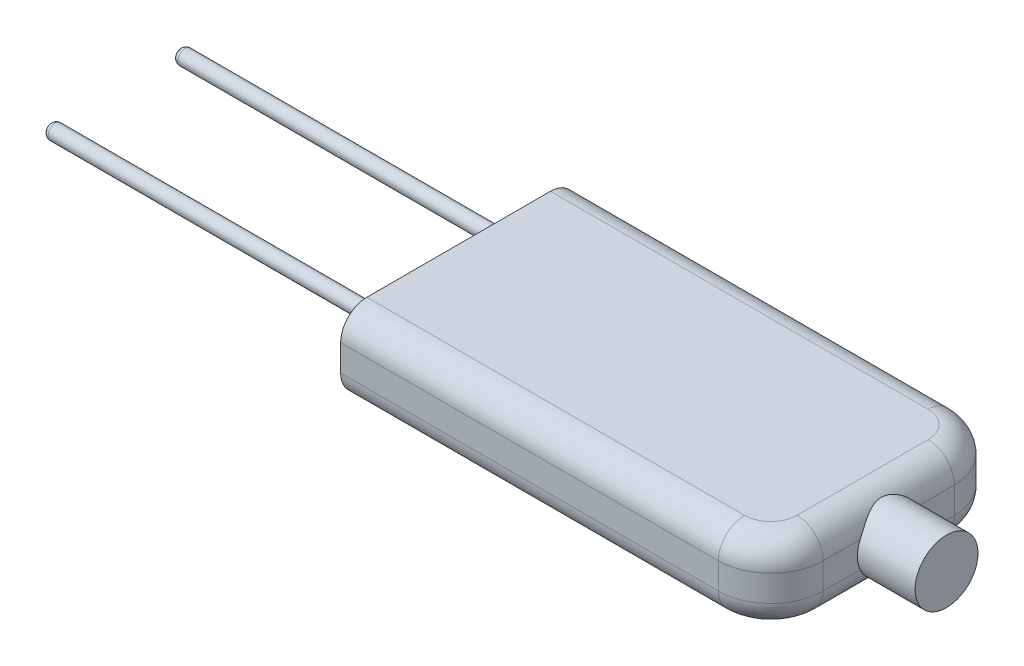
ISO-10303-21;
HEADER;
FILE_DESCRIPTION(('STEP AP214'),'2;1');
FILE_NAME('part.step','',(''),(''),'','','');
FILE_SCHEMA(('AUTOMOTIVE_DESIGN { 1 0 10303 214 1 1 1 1 }'));
ENDSEC;
DATA;
#1=APPLICATION_CONTEXT('core data for automotive mechanical design processes');
#2=APPLICATION_PROTOCOL_DEFINITION('international standard','automotive_design',2000,#1);
#3=PRODUCT_CONTEXT('',#1,'mechanical');
#4=PRODUCT('Part','Part','',(#3));
#5=PRODUCT_RELATED_PRODUCT_CATEGORY('part','',(#4));
#6=PRODUCT_DEFINITION_FORMATION('','',#4);
#7=PRODUCT_DEFINITION_CONTEXT('part definition',#1,'design');
#8=PRODUCT_DEFINITION('design','',#6,#7);
#9=PRODUCT_DEFINITION_SHAPE('','',#8);
#10=(LENGTH_UNIT() NAMED_UNIT(*) SI_UNIT(.MILLI.,.METRE.));
#11=(NAMED_UNIT(*) PLANE_ANGLE_UNIT() SI_UNIT($,.RADIAN.));
#12=(NAMED_UNIT(*) SI_UNIT($,.STERADIAN.) SOLID_ANGLE_UNIT());
#13=UNCERTAINTY_MEASURE_WITH_UNIT(LENGTH_MEASURE(1.E-05),#10,'distance_accuracy_value','');
#14=(GEOMETRIC_REPRESENTATION_CONTEXT(3) GLOBAL_UNCERTAINTY_ASSIGNED_CONTEXT((#13)) GLOBAL_UNIT_ASSIGNED_CONTEXT((#10,
#11,#12)) REPRESENTATION_CONTEXT('',''));
#15=CARTESIAN_POINT('',(0.,0.,0.));
#16=DIRECTION('',(0.,0.,1.));
#17=DIRECTION('',(1.,0.,0.));
#18=AXIS2_PLACEMENT_3D('',#15,#16,#17);
#19=CARTESIAN_POINT('',(82.,15.,-10.));
#20=DIRECTION('',(-1.,0.,0.));
#21=DIRECTION('',(0.,0.,1.));
#22=AXIS2_PLACEMENT_3D('',#19,#20,#21);
#23=PLANE('',#22);
#24=CARTESIAN_POINT('',(82.,7.5,-22.5));
#25=DIRECTION('',(-1.,0.,0.));
#26=DIRECTION('',(0.,0.,1.));
#27=AXIS2_PLACEMENT_3D('',#24,#25,#26);
#28=CIRCLE('',#27,6.);
#29=CARTESIAN_POINT('',(82.,5.,-27.9543560573178));
#30=VERTEX_POINT('',#29);
#31=CARTESIAN_POINT('',(82.,10.,-27.9543560573178));
#32=VERTEX_POINT('',#31);
#33=EDGE_CURVE('E57',#30,#32,#28,.F.);
#34=ORIENTED_EDGE('',*,*,#33,.F.);
#35=DIRECTION('',(0.,0.,-1.));
#36=VECTOR('',#35,1.);
#37=CARTESIAN_POINT('',(82.,5.,-35.));
#38=LINE('',#37,#36);
#39=CARTESIAN_POINT('',(82.,5.,-35.));
#40=VERTEX_POINT('',#39);
#41=EDGE_CURVE('E177',#30,#40,#38,.T.);
#42=ORIENTED_EDGE('',*,*,#41,.T.);
#43=DIRECTION('',(0.,-1.,0.));
#44=VECTOR('',#43,1.);
#45=CARTESIAN_POINT('',(82.,15.,-35.));
#46=LINE('',#45,#44);
#47=CARTESIAN_POINT('',(82.,10.,-35.));
#48=VERTEX_POINT('',#47);
#49=EDGE_CURVE('E364',#48,#40,#46,.T.);
#50=ORIENTED_EDGE('',*,*,#49,.F.);
#51=DIRECTION('',(0.,0.,-1.));
#52=VECTOR('',#51,1.);
#53=CARTESIAN_POINT('',(82.,10.,-10.));
#54=LINE('',#53,#52);
#55=EDGE_CURVE('E172',#48,#32,#54,.F.);
#56=ORIENTED_EDGE('',*,*,#55,.T.);
#57=EDGE_LOOP('',(#34,#42,#50,#56));
#58=FACE_BOUND('',#57,.T.);
#59=ADVANCED_FACE('F41',(#58),#23,.F.);
#60=CARTESIAN_POINT('',(77.,5.,-10.));
#61=DIRECTION('',(0.,0.,1.));
#62=DIRECTION('',(1.,0.,0.));
#63=AXIS2_PLACEMENT_3D('',#60,#61,#62);
#64=CYLINDRICAL_SURFACE('',#63,5.);
#65=ORIENTED_EDGE('',*,*,#41,.F.);
#66=CARTESIAN_POINT('',(82.,5.,-27.9543560573178));
#67=CARTESIAN_POINT('',(82.0000206078122,4.86811430190182,-27.8939434848491));
#68=CARTESIAN_POINT('',(81.9947843106151,4.73853451016481,-27.8287284437508));
#69=CARTESIAN_POINT('',(81.9750366002314,4.48514645133783,-27.6895479723205));
#70=CARTESIAN_POINT('',(81.9605396686491,4.36132949619952,-27.6155963509948));
#71=CARTESIAN_POINT('',(81.9236828228434,4.12138783610076,-27.4603665223907));
#72=CARTESIAN_POINT('',(81.9014011541239,4.00519977040379,-27.3791669982449));
#73=CARTESIAN_POINT('',(81.8501897811419,3.77974396942501,-27.2095223367052));
#74=CARTESIAN_POINT('',(81.8212575476597,3.67047888718214,-27.1210744510044));
#75=CARTESIAN_POINT('',(81.7581761789057,3.45994798360489,-26.938165001419));
#76=CARTESIAN_POINT('',(81.7240600834218,3.35863726492462,-26.8437435905785));
#77=CARTESIAN_POINT('',(81.6516920683105,3.16353703678495,-26.6489869142817));
#78=CARTESIAN_POINT('',(81.6134405828231,3.06974673961645,-26.5486522701084));
#79=CARTESIAN_POINT('',(81.4939074939547,2.79915696911305,-26.238649125854));
#80=CARTESIAN_POINT('',(81.4080598144038,2.63380163464768,-26.0205612433246));
#81=CARTESIAN_POINT('',(81.2685669195685,2.39419271926012,-25.6555782156911));
#82=CARTESIAN_POINT('',(81.2156851210521,2.30985272546184,-25.51484157985));
#83=CARTESIAN_POINT('',(81.1112320463222,2.15277872125521,-25.2265749694038));
#84=CARTESIAN_POINT('',(81.0596610820182,2.08004745177334,-25.0790434010167));
#85=CARTESIAN_POINT('',(80.9106523400192,1.88001033253256,-24.6269572453567));
#86=CARTESIAN_POINT('',(80.8186028075533,1.77035959207362,-24.312150549864));
#87=CARTESIAN_POINT('',(80.7177058825755,1.65629342619354,-23.866242897921));
#88=CARTESIAN_POINT('',(80.6929521926347,1.62907662821801,-23.7442018882714));
#89=CARTESIAN_POINT('',(80.6496032333209,1.5821915442243,-23.497628152133));
#90=CARTESIAN_POINT('',(80.6310041216067,1.56251854734135,-23.3730970319332));
#91=CARTESIAN_POINT('',(80.6009393157597,1.53103561541514,-23.1224121009216));
#92=CARTESIAN_POINT('',(80.5894610821,1.51921185565067,-22.9962615441395));
#93=CARTESIAN_POINT('',(80.5742370360371,1.50358030106402,-22.7429896167497));
#94=CARTESIAN_POINT('',(80.570491166131,1.49977244663026,-22.6158682533687));
#95=CARTESIAN_POINT('',(80.5709583576714,1.50024907489802,-22.3614033598221));
#96=CARTESIAN_POINT('',(80.5751872119432,1.50454961513737,-22.2340598888199));
#97=CARTESIAN_POINT('',(80.5913794966899,1.52118901703152,-21.9804054556393));
#98=CARTESIAN_POINT('',(80.6033430209725,1.53352797617783,-21.8540945060025));
#99=CARTESIAN_POINT('',(80.6343522626202,1.56605414035887,-21.6031630546645));
#100=CARTESIAN_POINT('',(80.6534094638615,1.58625407386382,-21.4785456355406));
#101=CARTESIAN_POINT('',(80.6976287171138,1.63420039034599,-21.2318458822736));
#102=CARTESIAN_POINT('',(80.7227945491546,1.66195144726089,-21.1097651688247));
#103=CARTESIAN_POINT('',(80.8238066651791,1.77653006243144,-20.6694412871725));
#104=CARTESIAN_POINT('',(80.9147444729556,1.88526427853597,-20.360004926468));
#105=CARTESIAN_POINT('',(81.0616543874105,2.08284902757324,-19.9152347829638));
#106=CARTESIAN_POINT('',(81.1124732570568,2.15461410302223,-19.7699712464438));
#107=CARTESIAN_POINT('',(81.2153935627314,2.3094456660752,-19.4859915441789));
#108=CARTESIAN_POINT('',(81.2674948560092,2.39251090044198,-19.3472746546768));
#109=CARTESIAN_POINT('',(81.3722489209929,2.57213054639544,-19.0730901532841));
#110=CARTESIAN_POINT('',(81.4248778922203,2.66899140344898,-18.9378147502189));
#111=CARTESIAN_POINT('',(81.5270741238093,2.87426594034905,-18.675033002042));
#112=CARTESIAN_POINT('',(81.5766409770184,2.98268115131223,-18.5475276901058));
#113=CARTESIAN_POINT('',(81.6703546241491,3.21034201274667,-18.3015729989937));
#114=CARTESIAN_POINT('',(81.7145250825754,3.32953607034424,-18.1830850082999));
#115=CARTESIAN_POINT('',(81.795561331734,3.57882093471574,-17.9554640004896));
#116=CARTESIAN_POINT('',(81.8324304907088,3.70890667733494,-17.8463266829572));
#117=CARTESIAN_POINT('',(81.8854973057507,3.93223406331174,-17.6747119597241));
#118=CARTESIAN_POINT('',(81.904422441446,4.02253064246881,-17.6092209154592));
#119=CARTESIAN_POINT('',(81.9376374241019,4.20719886811106,-17.4830327462725));
#120=CARTESIAN_POINT('',(81.9519290991216,4.30156889079065,-17.422333737896));
#121=CARTESIAN_POINT('',(81.9753541835157,4.49466747141161,-17.3056987261606));
#122=CARTESIAN_POINT('',(81.9844543362036,4.59341985666286,-17.2497953381409));
#123=CARTESIAN_POINT('',(81.9967845834705,4.79431411434572,-17.1434865020971));
#124=CARTESIAN_POINT('',(82.0000089357705,4.89645920325483,-17.093086477537));
#125=CARTESIAN_POINT('',(82.,5.,-17.0456439426821));
#126=B_SPLINE_CURVE_WITH_KNOTS('',3,(#66,#67,#68,#69,#70,#71,#72,#73,#74,#75,#76,#77,#78,#79,
#80,#81,#82,#83,#84,#85,#86,#87,#88,#89,#90,#91,#92,#93,#94,#95,#96,#97,#98,#99,#100,#101,#102,
#103,#104,#105,#106,#107,#108,#109,#110,#111,#112,#113,#114,#115,#116,#117,#118,#119,#120,#121,
#122,#123,#124,#125),.UNSPECIFIED.,.F.,.F.,(4,2,2,2,2,2,2,2,2,2,2,2,2,2,2,2,2,2,2,2,2,2,2,2,2,2,
2,2,2,4),(0.,0.434860604064224,0.869042840552932,1.29898096392539,1.72908286471325,
2.15655032545085,2.58397295345303,3.44151297424773,3.95819448323737,4.47499780559064,
5.50573967978283,5.88785171746291,6.26972474817521,6.65092339555977,7.03211920808833,
7.41407071843789,7.79602686125654,8.17860405718535,8.5614185986817,9.57608100281526,
10.0852004747092,10.5942635289813,11.1172296120256,11.6402650819037,12.1609176463485,
12.6813294604525,13.0205129430387,13.359562442794,13.7007601714588,14.0422911660372),.UNSPECIFIED.);
#127=CARTESIAN_POINT('',(82.,5.,-17.0456439426821));
#128=VERTEX_POINT('',#127);
#129=EDGE_CURVE('E232',#30,#128,#126,.T.);
#130=ORIENTED_EDGE('',*,*,#129,.T.);
#131=CARTESIAN_POINT('',(82.,5.,-10.));
#132=VERTEX_POINT('',#131);
#133=EDGE_CURVE('E162',#132,#128,#38,.T.);
#134=ORIENTED_EDGE('',*,*,#133,.F.);
#135=CARTESIAN_POINT('',(77.,5.,-10.));
#136=DIRECTION('',(0.,0.,-1.));
#137=DIRECTION('',(-1.,0.,0.));
#138=AXIS2_PLACEMENT_3D('',#135,#136,#137);
#139=CIRCLE('',#138,5.);
#140=CARTESIAN_POINT('',(77.,0.,-10.));
#141=VERTEX_POINT('',#140);
#142=EDGE_CURVE('E218',#132,#141,#139,.T.);
#143=ORIENTED_EDGE('',*,*,#142,.T.);
#144=DIRECTION('',(0.,0.,-1.));
#145=VECTOR('',#144,1.);
#146=CARTESIAN_POINT('',(77.,0.,-10.));
#147=LINE('',#146,#145);
#148=CARTESIAN_POINT('',(77.,0.,-35.));
#149=VERTEX_POINT('',#148);
#150=EDGE_CURVE('E351',#149,#141,#147,.F.);
#151=ORIENTED_EDGE('',*,*,#150,.F.);
#152=CARTESIAN_POINT('',(77.,5.,-35.));
#153=DIRECTION('',(0.,0.,-1.));
#154=DIRECTION('',(-1.,0.,0.));
#155=AXIS2_PLACEMENT_3D('',#152,#153,#154);
#156=CIRCLE('',#155,5.);
#157=EDGE_CURVE('E213',#40,#149,#156,.T.);
#158=ORIENTED_EDGE('',*,*,#157,.F.);
#159=EDGE_LOOP('',(#65,#130,#134,#143,#151,#158));
#160=FACE_BOUND('',#159,.T.);
#161=ADVANCED_FACE('F272',(#160),#64,.T.);
#162=CARTESIAN_POINT('',(77.,10.,-35.));
#163=DIRECTION('',(0.,0.,-1.));
#164=DIRECTION('',(-1.,0.,0.));
#165=AXIS2_PLACEMENT_3D('',#162,#163,#164);
#166=CYLINDRICAL_SURFACE('',#165,5.);
#167=CARTESIAN_POINT('',(82.,10.,-17.0456439426821));
#168=VERTEX_POINT('',#167);
#169=CARTESIAN_POINT('',(82.,10.,-10.));
#170=VERTEX_POINT('',#169);
#171=EDGE_CURVE('E159',#168,#170,#54,.F.);
#172=ORIENTED_EDGE('',*,*,#171,.F.);
#173=CARTESIAN_POINT('',(82.,10.,-17.0456439426821));
#174=CARTESIAN_POINT('',(82.0000206078122,10.1318856980982,-17.1060565151508));
#175=CARTESIAN_POINT('',(81.9947843106151,10.2614654898352,-17.1712715562491));
#176=CARTESIAN_POINT('',(81.9750366002314,10.5148535486622,-17.3104520276794));
#177=CARTESIAN_POINT('',(81.9605396686491,10.6386705038005,-17.3844036490051));
#178=CARTESIAN_POINT('',(81.9236828228434,10.8786121638992,-17.5396334776092));
#179=CARTESIAN_POINT('',(81.9014011541239,10.9948002295962,-17.620833001755));
#180=CARTESIAN_POINT('',(81.8501897811419,11.220256030575,-17.7904776632947));
#181=CARTESIAN_POINT('',(81.8212575476597,11.3295211128179,-17.8789255489955));
#182=CARTESIAN_POINT('',(81.7581761789057,11.5400520163951,-18.0618349985809));
#183=CARTESIAN_POINT('',(81.7240600834218,11.6413627350754,-18.1562564094214));
#184=CARTESIAN_POINT('',(81.6516920683105,11.836462963215,-18.3510130857182));
#185=CARTESIAN_POINT('',(81.6134405828231,11.9302532603836,-18.4513477298916));
#186=CARTESIAN_POINT('',(81.4939074939548,12.200843030887,-18.7613508741459));
#187=CARTESIAN_POINT('',(81.4080598144038,12.3661983653523,-18.9794387566754));
#188=CARTESIAN_POINT('',(81.2685669195685,12.6058072807399,-19.3444217843089));
#189=CARTESIAN_POINT('',(81.2156851210521,12.6901472745382,-19.48515842015));
#190=CARTESIAN_POINT('',(81.1112320463222,12.8472212787448,-19.7734250305962));
#191=CARTESIAN_POINT('',(81.0596610820182,12.9199525482267,-19.9209565989832));
#192=CARTESIAN_POINT('',(80.9106523400192,13.1199896674674,-20.3730427546432));
#193=CARTESIAN_POINT('',(80.8186028075533,13.2296404079264,-20.6878494501359));
#194=CARTESIAN_POINT('',(80.7177058825755,13.3437065738065,-21.1337571020789));
#195=CARTESIAN_POINT('',(80.6929521926347,13.370923371782,-21.2557981117285));
#196=CARTESIAN_POINT('',(80.6496032333209,13.4178084557757,-21.5023718478669));
#197=CARTESIAN_POINT('',(80.6310041216067,13.4374814526587,-21.6269029680667));
#198=CARTESIAN_POINT('',(80.6009393157597,13.4689643845849,-21.8775878990784));
#199=CARTESIAN_POINT('',(80.5894610821,13.4807881443493,-22.0037384558605));
#200=CARTESIAN_POINT('',(80.5742370360371,13.496419698936,-22.2570103832502));
#201=CARTESIAN_POINT('',(80.570491166131,13.5002275533697,-22.3841317466312));
#202=CARTESIAN_POINT('',(80.5709583576714,13.499750925102,-22.6385966401778));
#203=CARTESIAN_POINT('',(80.5751872119432,13.4954503848626,-22.7659401111801));
#204=CARTESIAN_POINT('',(80.5913794966899,13.4788109829685,-23.0195945443606));
#205=CARTESIAN_POINT('',(80.6033430209725,13.4664720238222,-23.1459054939974));
#206=CARTESIAN_POINT('',(80.6343522626202,13.4339458596411,-23.3968369453354));
#207=CARTESIAN_POINT('',(80.6534094638615,13.4137459261362,-23.5214543644594));
#208=CARTESIAN_POINT('',(80.6976287171138,13.365799609654,-23.7681541177263));
#209=CARTESIAN_POINT('',(80.7227945491546,13.3380485527391,-23.8902348311752));
#210=CARTESIAN_POINT('',(80.8238066651791,13.2234699375686,-24.3305587128274));
#211=CARTESIAN_POINT('',(80.9147444729556,13.114735721464,-24.6399950735319));
#212=CARTESIAN_POINT('',(81.0616543874105,12.9171509724268,-25.0847652170362));
#213=CARTESIAN_POINT('',(81.1124732570568,12.8453858969778,-25.2300287535561));
#214=CARTESIAN_POINT('',(81.2153935627314,12.6905543339248,-25.514008455821));
#215=CARTESIAN_POINT('',(81.2674948560092,12.607489099558,-25.6527253453232));
#216=CARTESIAN_POINT('',(81.3722489209929,12.4278694536046,-25.9269098467158));
#217=CARTESIAN_POINT('',(81.4248778922203,12.331008596551,-26.062185249781));
#218=CARTESIAN_POINT('',(81.5270741238093,12.1257340596509,-26.3249669979579));
#219=CARTESIAN_POINT('',(81.5766409770184,12.0173188486878,-26.4524723098942));
#220=CARTESIAN_POINT('',(81.6703546241491,11.7896579872533,-26.6984270010063));
#221=CARTESIAN_POINT('',(81.7145250825754,11.6704639296558,-26.8169149917));
#222=CARTESIAN_POINT('',(81.795561331734,11.4211790652843,-27.0445359995103));
#223=CARTESIAN_POINT('',(81.8324304907088,11.2910933226651,-27.1536733170428));
#224=CARTESIAN_POINT('',(81.8854973057507,11.0677659366883,-27.3252880402758));
#225=CARTESIAN_POINT('',(81.904422441446,10.9774693575312,-27.3907790845408));
#226=CARTESIAN_POINT('',(81.9376374241019,10.7928011318889,-27.5169672537274));
#227=CARTESIAN_POINT('',(81.9519290991216,10.6984311092094,-27.5776662621039));
#228=CARTESIAN_POINT('',(81.9753541835157,10.5053325285884,-27.6943012738393));
#229=CARTESIAN_POINT('',(81.9844543362036,10.4065801433371,-27.7502046618591));
#230=CARTESIAN_POINT('',(81.9967845834705,10.2056858856543,-27.8565134979028));
#231=CARTESIAN_POINT('',(82.0000089357705,10.1035407967452,-27.9069135224629));
#232=CARTESIAN_POINT('',(82.,9.99999999999999,-27.9543560573178));
#233=B_SPLINE_CURVE_WITH_KNOTS('',3,(#173,#174,#175,#176,#177,#178,#179,#180,#181,#182,#183,
#184,#185,#186,#187,#188,#189,#190,#191,#192,#193,#194,#195,#196,#197,#198,#199,#200,#201,#202,
#203,#204,#205,#206,#207,#208,#209,#210,#211,#212,#213,#214,#215,#216,#217,#218,#219,#220,#221,
#222,#223,#224,#225,#226,#227,#228,#229,#230,#231,#232),.UNSPECIFIED.,.F.,.F.,(4,2,2,2,2,2,2,2,
2,2,2,2,2,2,2,2,2,2,2,2,2,2,2,2,2,2,2,2,2,4),(0.,0.434860604064224,0.869042840552934,
1.2989809639254,1.72908286471325,2.15655032545085,2.58397295345304,3.44151297424773,
3.95819448323737,4.47499780559064,5.50573967978283,5.88785171746291,6.26972474817521,
6.65092339555977,7.03211920808833,7.41407071843789,7.79602686125654,8.17860405718535,
8.5614185986817,9.57608100281526,10.0852004747092,10.5942635289813,11.1172296120257,
11.6402650819037,12.1609176463485,12.6813294604525,13.0205129430387,13.359562442794,
13.7007601714588,14.0422911660372),.UNSPECIFIED.);
#234=EDGE_CURVE('E141',#168,#32,#233,.T.);
#235=ORIENTED_EDGE('',*,*,#234,.T.);
#236=ORIENTED_EDGE('',*,*,#55,.F.);
#237=CARTESIAN_POINT('',(77.,10.,-35.));
#238=DIRECTION('',(0.,0.,-1.));
#239=DIRECTION('',(-1.,0.,0.));
#240=AXIS2_PLACEMENT_3D('',#237,#238,#239);
#241=CIRCLE('',#240,5.);
#242=CARTESIAN_POINT('',(77.,15.,-35.));
#243=VERTEX_POINT('',#242);
#244=EDGE_CURVE('E231',#243,#48,#241,.T.);
#245=ORIENTED_EDGE('',*,*,#244,.F.);
#246=DIRECTION('',(0.,0.,-1.));
#247=VECTOR('',#246,1.);
#248=CARTESIAN_POINT('',(77.,15.,-35.));
#249=LINE('',#248,#247);
#250=CARTESIAN_POINT('',(77.,15.,-10.));
#251=VERTEX_POINT('',#250);
#252=EDGE_CURVE('E196',#251,#243,#249,.T.);
#253=ORIENTED_EDGE('',*,*,#252,.F.);
#254=CARTESIAN_POINT('',(77.,10.,-10.));
#255=DIRECTION('',(0.,0.,-1.));
#256=DIRECTION('',(-1.,0.,0.));
#257=AXIS2_PLACEMENT_3D('',#254,#255,#256);
#258=CIRCLE('',#257,5.);
#259=EDGE_CURVE('E170',#251,#170,#258,.T.);
#260=ORIENTED_EDGE('',*,*,#259,.T.);
#261=EDGE_LOOP('',(#172,#235,#236,#245,#253,#260));
#262=FACE_BOUND('',#261,.T.);
#263=ADVANCED_FACE('F167',(#262),#166,.T.);
#264=CARTESIAN_POINT('',(0.,15.,0.));
#265=DIRECTION('',(1.,0.,0.));
#266=DIRECTION('',(0.,0.,-1.));
#267=AXIS2_PLACEMENT_3D('',#264,#265,#266);
#268=PLANE('',#267);
#269=CARTESIAN_POINT('',(0.,7.5,-10.15));
#270=DIRECTION('',(1.,0.,0.));
#271=DIRECTION('',(0.,0.,-1.));
#272=AXIS2_PLACEMENT_3D('',#269,#270,#271);
#273=CIRCLE('',#272,1.4);
#274=CARTESIAN_POINT('',(0.,7.5,-11.55));
#275=VERTEX_POINT('',#274);
#276=EDGE_CURVE('E476',#275,#275,#273,.F.);
#277=ORIENTED_EDGE('',*,*,#276,.F.);
#278=EDGE_LOOP('',(#277));
#279=FACE_BOUND('',#278,.T.);
#280=CARTESIAN_POINT('',(0.,7.5,-34.85));
#281=DIRECTION('',(1.,0.,0.));
#282=DIRECTION('',(0.,0.,-1.));
#283=AXIS2_PLACEMENT_3D('',#280,#281,#282);
#284=CIRCLE('',#283,1.4);
#285=CARTESIAN_POINT('',(0.,7.5,-36.25));
#286=VERTEX_POINT('',#285);
#287=EDGE_CURVE('E152',#286,#286,#284,.F.);
#288=ORIENTED_EDGE('',*,*,#287,.F.);
#289=EDGE_LOOP('',(#288));
#290=FACE_BOUND('',#289,.T.);
#291=DIRECTION('',(0.,-1.,0.));
#292=VECTOR('',#291,1.);
#293=CARTESIAN_POINT('',(0.,15.,-45.));
#294=LINE('',#293,#292);
#295=CARTESIAN_POINT('',(0.,10.,-45.));
#296=VERTEX_POINT('',#295);
#297=CARTESIAN_POINT('',(0.,5.,-45.));
#298=VERTEX_POINT('',#297);
#299=EDGE_CURVE('E385',#296,#298,#294,.T.);
#300=ORIENTED_EDGE('',*,*,#299,.T.);
#301=CARTESIAN_POINT('',(0.,5.,-40.));
#302=DIRECTION('',(1.,0.,0.));
#303=DIRECTION('',(0.,0.,-1.));
#304=AXIS2_PLACEMENT_3D('',#301,#302,#303);
#305=CIRCLE('',#304,5.);
#306=CARTESIAN_POINT('',(0.,0.,-40.));
#307=VERTEX_POINT('',#306);
#308=EDGE_CURVE('E416',#298,#307,#305,.F.);
#309=ORIENTED_EDGE('',*,*,#308,.T.);
#310=DIRECTION('',(0.,0.,1.));
#311=VECTOR('',#310,1.);
#312=CARTESIAN_POINT('',(0.,0.,0.));
#313=LINE('',#312,#311);
#314=CARTESIAN_POINT('',(0.,0.,-5.));
#315=VERTEX_POINT('',#314);
#316=EDGE_CURVE('E226',#307,#315,#313,.T.);
#317=ORIENTED_EDGE('',*,*,#316,.T.);
#318=CARTESIAN_POINT('',(0.,5.,-5.));
#319=DIRECTION('',(1.,0.,0.));
#320=DIRECTION('',(0.,0.,-1.));
#321=AXIS2_PLACEMENT_3D('',#318,#319,#320);
#322=CIRCLE('',#321,5.);
#323=CARTESIAN_POINT('',(0.,5.,0.));
#324=VERTEX_POINT('',#323);
#325=EDGE_CURVE('E411',#315,#324,#322,.F.);
#326=ORIENTED_EDGE('',*,*,#325,.T.);
#327=DIRECTION('',(0.,-1.,0.));
#328=VECTOR('',#327,1.);
#329=CARTESIAN_POINT('',(0.,15.,0.));
#330=LINE('',#329,#328);
#331=CARTESIAN_POINT('',(0.,10.,0.));
#332=VERTEX_POINT('',#331);
#333=EDGE_CURVE('E400',#332,#324,#330,.T.);
#334=ORIENTED_EDGE('',*,*,#333,.F.);
#335=CARTESIAN_POINT('',(0.,10.,-5.));
#336=DIRECTION('',(1.,0.,0.));
#337=DIRECTION('',(0.,0.,-1.));
#338=AXIS2_PLACEMENT_3D('',#335,#336,#337);
#339=CIRCLE('',#338,5.);
#340=CARTESIAN_POINT('',(0.,15.,-5.));
#341=VERTEX_POINT('',#340);
#342=EDGE_CURVE('E383',#332,#341,#339,.F.);
#343=ORIENTED_EDGE('',*,*,#342,.T.);
#344=DIRECTION('',(0.,0.,1.));
#345=VECTOR('',#344,1.);
#346=CARTESIAN_POINT('',(0.,15.,0.));
#347=LINE('',#346,#345);
#348=CARTESIAN_POINT('',(0.,15.,-40.));
#349=VERTEX_POINT('',#348);
#350=EDGE_CURVE('E270',#349,#341,#347,.T.);
#351=ORIENTED_EDGE('',*,*,#350,.F.);
#352=CARTESIAN_POINT('',(0.,10.,-40.));
#353=DIRECTION('',(1.,0.,0.));
#354=DIRECTION('',(0.,0.,-1.));
#355=AXIS2_PLACEMENT_3D('',#352,#353,#354);
#356=CIRCLE('',#355,5.);
#357=EDGE_CURVE('E374',#349,#296,#356,.F.);
#358=ORIENTED_EDGE('',*,*,#357,.T.);
#359=EDGE_LOOP('',(#300,#309,#317,#326,#334,#343,#351,#358));
#360=FACE_BOUND('',#359,.T.);
#361=ADVANCED_FACE('F321',(#279,#290,#360),#268,.F.);
#362=CARTESIAN_POINT('',(0.,15.,0.));
#363=DIRECTION('',(0.,0.,-1.));
#364=DIRECTION('',(-1.,0.,0.));
#365=AXIS2_PLACEMENT_3D('',#362,#363,#364);
#366=PLANE('',#365);
#367=ORIENTED_EDGE('',*,*,#333,.T.);
#368=DIRECTION('',(1.,0.,0.));
#369=VECTOR('',#368,1.);
#370=CARTESIAN_POINT('',(72.,5.,0.));
#371=LINE('',#370,#369);
#372=CARTESIAN_POINT('',(72.,5.,0.));
#373=VERTEX_POINT('',#372);
#374=EDGE_CURVE('E153',#324,#373,#371,.T.);
#375=ORIENTED_EDGE('',*,*,#374,.T.);
#376=DIRECTION('',(0.,-1.,0.));
#377=VECTOR('',#376,1.);
#378=CARTESIAN_POINT('',(72.,15.,0.));
#379=LINE('',#378,#377);
#380=CARTESIAN_POINT('',(72.,10.,0.));
#381=VERTEX_POINT('',#380);
#382=EDGE_CURVE('E397',#381,#373,#379,.T.);
#383=ORIENTED_EDGE('',*,*,#382,.F.);
#384=DIRECTION('',(1.,0.,0.));
#385=VECTOR('',#384,1.);
#386=CARTESIAN_POINT('',(0.,10.,0.));
#387=LINE('',#386,#385);
#388=EDGE_CURVE('E204',#381,#332,#387,.F.);
#389=ORIENTED_EDGE('',*,*,#388,.T.);
#390=EDGE_LOOP('',(#367,#375,#383,#389));
#391=FACE_BOUND('',#390,.T.);
#392=ADVANCED_FACE('F316',(#391),#366,.F.);
#393=CARTESIAN_POINT('',(72.,15.,-10.));
#394=DIRECTION('',(0.,-1.,0.));
#395=DIRECTION('',(0.,0.,-1.));
#396=AXIS2_PLACEMENT_3D('',#393,#394,#395);
#397=CYLINDRICAL_SURFACE('',#396,10.);
#398=ORIENTED_EDGE('',*,*,#382,.T.);
#399=CARTESIAN_POINT('',(72.,5.,-10.));
#400=DIRECTION('',(0.,-1.,0.));
#401=DIRECTION('',(0.,0.,-1.));
#402=AXIS2_PLACEMENT_3D('',#399,#400,#401);
#403=CIRCLE('',#402,10.);
#404=EDGE_CURVE('E187',#373,#132,#403,.F.);
#405=ORIENTED_EDGE('',*,*,#404,.T.);
#406=DIRECTION('',(0.,-1.,0.));
#407=VECTOR('',#406,1.);
#408=CARTESIAN_POINT('',(82.,15.,-10.));
#409=LINE('',#408,#407);
#410=EDGE_CURVE('E369',#170,#132,#409,.T.);
#411=ORIENTED_EDGE('',*,*,#410,.F.);
#412=CARTESIAN_POINT('',(72.,10.,-10.));
#413=DIRECTION('',(0.,-1.,0.));
#414=DIRECTION('',(0.,0.,-1.));
#415=AXIS2_PLACEMENT_3D('',#412,#413,#414);
#416=CIRCLE('',#415,10.);
#417=EDGE_CURVE('E184',#170,#381,#416,.T.);
#418=ORIENTED_EDGE('',*,*,#417,.T.);
#419=EDGE_LOOP('',(#398,#405,#411,#418));
#420=FACE_BOUND('',#419,.T.);
#421=ADVANCED_FACE('F309',(#420),#397,.T.);
#422=EDGE_CURVE('E145',#168,#128,#28,.F.);
#423=ORIENTED_EDGE('',*,*,#422,.F.);
#424=ORIENTED_EDGE('',*,*,#171,.T.);
#425=ORIENTED_EDGE('',*,*,#410,.T.);
#426=ORIENTED_EDGE('',*,*,#133,.T.);
#427=EDGE_LOOP('',(#423,#424,#425,#426));
#428=FACE_BOUND('',#427,.T.);
#429=ADVANCED_FACE('F157',(#428),#23,.F.);
#430=CARTESIAN_POINT('',(72.,15.,-35.));
#431=DIRECTION('',(0.,-1.,0.));
#432=DIRECTION('',(0.,0.,-1.));
#433=AXIS2_PLACEMENT_3D('',#430,#431,#432);
#434=CYLINDRICAL_SURFACE('',#433,10.);
#435=ORIENTED_EDGE('',*,*,#49,.T.);
#436=CARTESIAN_POINT('',(72.,5.,-35.));
#437=DIRECTION('',(0.,-1.,0.));
#438=DIRECTION('',(0.,0.,-1.));
#439=AXIS2_PLACEMENT_3D('',#436,#437,#438);
#440=CIRCLE('',#439,10.);
#441=CARTESIAN_POINT('',(72.,5.,-45.));
#442=VERTEX_POINT('',#441);
#443=EDGE_CURVE('E173',#40,#442,#440,.F.);
#444=ORIENTED_EDGE('',*,*,#443,.T.);
#445=DIRECTION('',(0.,-1.,0.));
#446=VECTOR('',#445,1.);
#447=CARTESIAN_POINT('',(72.,15.,-45.));
#448=LINE('',#447,#446);
#449=CARTESIAN_POINT('',(72.,10.,-45.));
#450=VERTEX_POINT('',#449);
#451=EDGE_CURVE('E366',#450,#442,#448,.T.);
#452=ORIENTED_EDGE('',*,*,#451,.F.);
#453=CARTESIAN_POINT('',(72.,10.,-35.));
#454=DIRECTION('',(0.,-1.,0.));
#455=DIRECTION('',(0.,0.,-1.));
#456=AXIS2_PLACEMENT_3D('',#453,#454,#455);
#457=CIRCLE('',#456,10.);
#458=EDGE_CURVE('E178',#450,#48,#457,.T.);
#459=ORIENTED_EDGE('',*,*,#458,.T.);
#460=EDGE_LOOP('',(#435,#444,#452,#459));
#461=FACE_BOUND('',#460,.T.);
#462=ADVANCED_FACE('F308',(#461),#434,.T.);
#463=CARTESIAN_POINT('',(0.,15.,-45.));
#464=DIRECTION('',(0.,0.,1.));
#465=DIRECTION('',(1.,0.,0.));
#466=AXIS2_PLACEMENT_3D('',#463,#464,#465);
#467=PLANE('',#466);
#468=ORIENTED_EDGE('',*,*,#451,.T.);
#469=DIRECTION('',(-1.,0.,0.));
#470=VECTOR('',#469,1.);
#471=CARTESIAN_POINT('',(0.,5.,-45.));
#472=LINE('',#471,#470);
#473=EDGE_CURVE('E343',#442,#298,#472,.T.);
#474=ORIENTED_EDGE('',*,*,#473,.T.);
#475=ORIENTED_EDGE('',*,*,#299,.F.);
#476=DIRECTION('',(-1.,0.,0.));
#477=VECTOR('',#476,1.);
#478=CARTESIAN_POINT('',(0.,10.,-45.));
#479=LINE('',#478,#477);
#480=EDGE_CURVE('E404',#296,#450,#479,.F.);
#481=ORIENTED_EDGE('',*,*,#480,.T.);
#482=EDGE_LOOP('',(#468,#474,#475,#481));
#483=FACE_BOUND('',#482,.T.);
#484=ADVANCED_FACE('F314',(#483),#467,.F.);
#485=CARTESIAN_POINT('',(72.,15.,-35.));
#486=DIRECTION('',(0.,-1.,0.));
#487=DIRECTION('',(0.,0.,-1.));
#488=AXIS2_PLACEMENT_3D('',#485,#486,#487);
#489=PLANE('',#488);
#490=CARTESIAN_POINT('',(72.,15.,-35.));
#491=DIRECTION('',(0.,-1.,0.));
#492=DIRECTION('',(0.,0.,-1.));
#493=AXIS2_PLACEMENT_3D('',#490,#491,#492);
#494=CIRCLE('',#493,5.);
#495=CARTESIAN_POINT('',(72.,15.,-40.));
#496=VERTEX_POINT('',#495);
#497=EDGE_CURVE('E65',#243,#496,#494,.F.);
#498=ORIENTED_EDGE('',*,*,#497,.T.);
#499=DIRECTION('',(-1.,0.,0.));
#500=VECTOR('',#499,1.);
#501=CARTESIAN_POINT('',(72.,15.,-40.));
#502=LINE('',#501,#500);
#503=EDGE_CURVE('E201',#496,#349,#502,.T.);
#504=ORIENTED_EDGE('',*,*,#503,.T.);
#505=ORIENTED_EDGE('',*,*,#350,.T.);
#506=DIRECTION('',(1.,0.,0.));
#507=VECTOR('',#506,1.);
#508=CARTESIAN_POINT('',(72.,15.,-5.));
#509=LINE('',#508,#507);
#510=CARTESIAN_POINT('',(72.,15.,-5.));
#511=VERTEX_POINT('',#510);
#512=EDGE_CURVE('E190',#341,#511,#509,.T.);
#513=ORIENTED_EDGE('',*,*,#512,.T.);
#514=CARTESIAN_POINT('',(72.,15.,-10.));
#515=DIRECTION('',(0.,-1.,0.));
#516=DIRECTION('',(0.,0.,-1.));
#517=AXIS2_PLACEMENT_3D('',#514,#515,#516);
#518=CIRCLE('',#517,5.);
#519=EDGE_CURVE('E193',#511,#251,#518,.F.);
#520=ORIENTED_EDGE('',*,*,#519,.T.);
#521=ORIENTED_EDGE('',*,*,#252,.T.);
#522=EDGE_LOOP('',(#498,#504,#505,#513,#520,#521));
#523=FACE_BOUND('',#522,.T.);
#524=ADVANCED_FACE('F258',(#523),#489,.F.);
#525=CARTESIAN_POINT('',(72.,0.,-35.));
#526=DIRECTION('',(0.,-1.,0.));
#527=DIRECTION('',(0.,0.,-1.));
#528=AXIS2_PLACEMENT_3D('',#525,#526,#527);
#529=PLANE('',#528);
#530=ORIENTED_EDGE('',*,*,#316,.F.);
#531=DIRECTION('',(-1.,0.,0.));
#532=VECTOR('',#531,1.);
#533=CARTESIAN_POINT('',(72.,0.,-40.));
#534=LINE('',#533,#532);
#535=CARTESIAN_POINT('',(72.,0.,-40.));
#536=VERTEX_POINT('',#535);
#537=EDGE_CURVE('E341',#307,#536,#534,.F.);
#538=ORIENTED_EDGE('',*,*,#537,.T.);
#539=CARTESIAN_POINT('',(72.,0.,-35.));
#540=DIRECTION('',(0.,-1.,0.));
#541=DIRECTION('',(0.,0.,-1.));
#542=AXIS2_PLACEMENT_3D('',#539,#540,#541);
#543=CIRCLE('',#542,5.);
#544=EDGE_CURVE('E346',#536,#149,#543,.T.);
#545=ORIENTED_EDGE('',*,*,#544,.T.);
#546=ORIENTED_EDGE('',*,*,#150,.T.);
#547=CARTESIAN_POINT('',(72.,0.,-10.));
#548=DIRECTION('',(0.,-1.,0.));
#549=DIRECTION('',(0.,0.,-1.));
#550=AXIS2_PLACEMENT_3D('',#547,#548,#549);
#551=CIRCLE('',#550,5.);
#552=CARTESIAN_POINT('',(72.,0.,-5.));
#553=VERTEX_POINT('',#552);
#554=EDGE_CURVE('E356',#141,#553,#551,.T.);
#555=ORIENTED_EDGE('',*,*,#554,.T.);
#556=DIRECTION('',(1.,0.,0.));
#557=VECTOR('',#556,1.);
#558=CARTESIAN_POINT('',(0.,0.,-5.));
#559=LINE('',#558,#557);
#560=EDGE_CURVE('E419',#553,#315,#559,.F.);
#561=ORIENTED_EDGE('',*,*,#560,.T.);
#562=EDGE_LOOP('',(#530,#538,#545,#546,#555,#561));
#563=FACE_BOUND('',#562,.T.);
#564=ADVANCED_FACE('F287',(#563),#529,.T.);
#565=CARTESIAN_POINT('',(0.,5.,-5.));
#566=DIRECTION('',(-1.,0.,0.));
#567=DIRECTION('',(0.,0.,1.));
#568=AXIS2_PLACEMENT_3D('',#565,#566,#567);
#569=CYLINDRICAL_SURFACE('',#568,5.);
#570=ORIENTED_EDGE('',*,*,#325,.F.);
#571=ORIENTED_EDGE('',*,*,#560,.F.);
#572=CARTESIAN_POINT('',(72.,5.,-5.));
#573=DIRECTION('',(1.,0.,0.));
#574=DIRECTION('',(0.,0.,-1.));
#575=AXIS2_PLACEMENT_3D('',#572,#573,#574);
#576=CIRCLE('',#575,5.);
#577=EDGE_CURVE('E222',#373,#553,#576,.T.);
#578=ORIENTED_EDGE('',*,*,#577,.F.);
#579=ORIENTED_EDGE('',*,*,#374,.F.);
#580=EDGE_LOOP('',(#570,#571,#578,#579));
#581=FACE_BOUND('',#580,.T.);
#582=ADVANCED_FACE('F283',(#581),#569,.T.);
#583=CARTESIAN_POINT('',(72.,5.,-10.));
#584=DIRECTION('',(0.,-1.,0.));
#585=DIRECTION('',(0.,0.,-1.));
#586=AXIS2_PLACEMENT_3D('',#583,#584,#585);
#587=DEGENERATE_TOROIDAL_SURFACE('',#586,5.,5.,.T.);
#588=ORIENTED_EDGE('',*,*,#577,.T.);
#589=ORIENTED_EDGE('',*,*,#554,.F.);
#590=ORIENTED_EDGE('',*,*,#142,.F.);
#591=ORIENTED_EDGE('',*,*,#404,.F.);
#592=EDGE_LOOP('',(#588,#589,#590,#591));
#593=FACE_BOUND('',#592,.T.);
#594=ADVANCED_FACE('F280',(#593),#587,.T.);
#595=CARTESIAN_POINT('',(72.,5.,-35.));
#596=DIRECTION('',(0.,-1.,0.));
#597=DIRECTION('',(0.,0.,-1.));
#598=AXIS2_PLACEMENT_3D('',#595,#596,#597);
#599=DEGENERATE_TOROIDAL_SURFACE('',#598,5.,5.,.T.);
#600=ORIENTED_EDGE('',*,*,#157,.T.);
#601=ORIENTED_EDGE('',*,*,#544,.F.);
#602=CARTESIAN_POINT('',(72.,5.,-40.));
#603=DIRECTION('',(-1.,0.,0.));
#604=DIRECTION('',(0.,0.,1.));
#605=AXIS2_PLACEMENT_3D('',#602,#603,#604);
#606=CIRCLE('',#605,5.);
#607=EDGE_CURVE('E209',#442,#536,#606,.T.);
#608=ORIENTED_EDGE('',*,*,#607,.F.);
#609=ORIENTED_EDGE('',*,*,#443,.F.);
#610=EDGE_LOOP('',(#600,#601,#608,#609));
#611=FACE_BOUND('',#610,.T.);
#612=ADVANCED_FACE('F278',(#611),#599,.T.);
#613=CARTESIAN_POINT('',(0.,5.,-40.));
#614=DIRECTION('',(1.,0.,0.));
#615=DIRECTION('',(0.,0.,-1.));
#616=AXIS2_PLACEMENT_3D('',#613,#614,#615);
#617=CYLINDRICAL_SURFACE('',#616,5.);
#618=ORIENTED_EDGE('',*,*,#607,.T.);
#619=ORIENTED_EDGE('',*,*,#537,.F.);
#620=ORIENTED_EDGE('',*,*,#308,.F.);
#621=ORIENTED_EDGE('',*,*,#473,.F.);
#622=EDGE_LOOP('',(#618,#619,#620,#621));
#623=FACE_BOUND('',#622,.T.);
#624=ADVANCED_FACE('F328',(#623),#617,.T.);
#625=CARTESIAN_POINT('',(72.,10.,-5.));
#626=DIRECTION('',(1.,0.,0.));
#627=DIRECTION('',(0.,0.,-1.));
#628=AXIS2_PLACEMENT_3D('',#625,#626,#627);
#629=CYLINDRICAL_SURFACE('',#628,5.);
#630=ORIENTED_EDGE('',*,*,#342,.F.);
#631=ORIENTED_EDGE('',*,*,#388,.F.);
#632=CARTESIAN_POINT('',(72.,10.,-5.));
#633=DIRECTION('',(1.,0.,0.));
#634=DIRECTION('',(0.,0.,-1.));
#635=AXIS2_PLACEMENT_3D('',#632,#633,#634);
#636=CIRCLE('',#635,5.);
#637=EDGE_CURVE('E214',#511,#381,#636,.T.);
#638=ORIENTED_EDGE('',*,*,#637,.F.);
#639=ORIENTED_EDGE('',*,*,#512,.F.);
#640=EDGE_LOOP('',(#630,#631,#638,#639));
#641=FACE_BOUND('',#640,.T.);
#642=ADVANCED_FACE('F298',(#641),#629,.T.);
#643=CARTESIAN_POINT('',(72.,10.,-10.));
#644=DIRECTION('',(0.,-1.,0.));
#645=DIRECTION('',(0.,0.,-1.));
#646=AXIS2_PLACEMENT_3D('',#643,#644,#645);
#647=DEGENERATE_TOROIDAL_SURFACE('',#646,5.,5.,.T.);
#648=ORIENTED_EDGE('',*,*,#637,.T.);
#649=ORIENTED_EDGE('',*,*,#417,.F.);
#650=ORIENTED_EDGE('',*,*,#259,.F.);
#651=ORIENTED_EDGE('',*,*,#519,.F.);
#652=EDGE_LOOP('',(#648,#649,#650,#651));
#653=FACE_BOUND('',#652,.T.);
#654=ADVANCED_FACE('F293',(#653),#647,.T.);
#655=CARTESIAN_POINT('',(72.,10.,-35.));
#656=DIRECTION('',(0.,-1.,0.));
#657=DIRECTION('',(0.,0.,-1.));
#658=AXIS2_PLACEMENT_3D('',#655,#656,#657);
#659=DEGENERATE_TOROIDAL_SURFACE('',#658,5.,5.,.T.);
#660=ORIENTED_EDGE('',*,*,#244,.T.);
#661=ORIENTED_EDGE('',*,*,#458,.F.);
#662=CARTESIAN_POINT('',(72.,10.,-40.));
#663=DIRECTION('',(-1.,0.,0.));
#664=DIRECTION('',(0.,0.,1.));
#665=AXIS2_PLACEMENT_3D('',#662,#663,#664);
#666=CIRCLE('',#665,5.);
#667=EDGE_CURVE('E227',#496,#450,#666,.T.);
#668=ORIENTED_EDGE('',*,*,#667,.F.);
#669=ORIENTED_EDGE('',*,*,#497,.F.);
#670=EDGE_LOOP('',(#660,#661,#668,#669));
#671=FACE_BOUND('',#670,.T.);
#672=ADVANCED_FACE('F290',(#671),#659,.T.);
#673=CARTESIAN_POINT('',(72.,10.,-40.));
#674=DIRECTION('',(-1.,0.,0.));
#675=DIRECTION('',(0.,0.,1.));
#676=AXIS2_PLACEMENT_3D('',#673,#674,#675);
#677=CYLINDRICAL_SURFACE('',#676,5.);
#678=ORIENTED_EDGE('',*,*,#667,.T.);
#679=ORIENTED_EDGE('',*,*,#480,.F.);
#680=ORIENTED_EDGE('',*,*,#357,.F.);
#681=ORIENTED_EDGE('',*,*,#503,.F.);
#682=EDGE_LOOP('',(#678,#679,#680,#681));
#683=FACE_BOUND('',#682,.T.);
#684=ADVANCED_FACE('F256',(#683),#677,.T.);
#685=CARTESIAN_POINT('',(93.,7.5,-22.5));
#686=DIRECTION('',(-1.,0.,0.));
#687=DIRECTION('',(0.,0.,1.));
#688=AXIS2_PLACEMENT_3D('',#685,#686,#687);
#689=CYLINDRICAL_SURFACE('',#688,6.);
#690=ORIENTED_EDGE('',*,*,#129,.F.);
#691=ORIENTED_EDGE('',*,*,#33,.T.);
#692=ORIENTED_EDGE('',*,*,#234,.F.);
#693=ORIENTED_EDGE('',*,*,#422,.T.);
#694=EDGE_LOOP('',(#690,#691,#692,#693));
#695=FACE_BOUND('',#694,.T.);
#696=CARTESIAN_POINT('',(93.,7.5,-22.5));
#697=DIRECTION('',(1.,0.,0.));
#698=DIRECTION('',(0.,0.,-1.));
#699=AXIS2_PLACEMENT_3D('',#696,#697,#698);
#700=CIRCLE('',#699,6.);
#701=CARTESIAN_POINT('',(93.,7.5,-28.5));
#702=VERTEX_POINT('',#701);
#703=EDGE_CURVE('E164',#702,#702,#700,.T.);
#704=ORIENTED_EDGE('',*,*,#703,.F.);
#705=EDGE_LOOP('',(#704));
#706=FACE_BOUND('',#705,.T.);
#707=ADVANCED_FACE('F143',(#695,#706),#689,.T.);
#708=CARTESIAN_POINT('',(93.,7.5,-22.5));
#709=DIRECTION('',(1.,0.,0.));
#710=DIRECTION('',(0.,0.,-1.));
#711=AXIS2_PLACEMENT_3D('',#708,#709,#710);
#712=PLANE('',#711);
#713=ORIENTED_EDGE('',*,*,#703,.T.);
#714=EDGE_LOOP('',(#713));
#715=FACE_BOUND('',#714,.T.);
#716=ADVANCED_FACE('F255',(#715),#712,.T.);
#717=CARTESIAN_POINT('',(-65.5,7.5,-34.85));
#718=DIRECTION('',(1.,0.,0.));
#719=DIRECTION('',(0.,0.,-1.));
#720=AXIS2_PLACEMENT_3D('',#717,#718,#719);
#721=CYLINDRICAL_SURFACE('',#720,1.4);
#722=CARTESIAN_POINT('',(-64.5,7.5,-34.85));
#723=DIRECTION('',(-1.,0.,0.));
#724=DIRECTION('',(0.,0.,1.));
#725=AXIS2_PLACEMENT_3D('',#722,#723,#724);
#726=CIRCLE('',#725,1.4);
#727=CARTESIAN_POINT('',(-64.5,7.5,-33.45));
#728=VERTEX_POINT('',#727);
#729=EDGE_CURVE('E469',#728,#728,#726,.F.);
#730=ORIENTED_EDGE('',*,*,#729,.T.);
#731=EDGE_LOOP('',(#730));
#732=FACE_BOUND('',#731,.T.);
#733=ORIENTED_EDGE('',*,*,#287,.T.);
#734=EDGE_LOOP('',(#733));
#735=FACE_BOUND('',#734,.T.);
#736=ADVANCED_FACE('F439',(#732,#735),#721,.T.);
#737=CARTESIAN_POINT('',(-65.5,7.5,-34.85));
#738=DIRECTION('',(-1.,0.,0.));
#739=DIRECTION('',(0.,0.,1.));
#740=AXIS2_PLACEMENT_3D('',#737,#738,#739);
#741=PLANE('',#740);
#742=CARTESIAN_POINT('',(-65.5,7.5,-34.85));
#743=DIRECTION('',(-1.,0.,0.));
#744=DIRECTION('',(0.,0.,1.));
#745=AXIS2_PLACEMENT_3D('',#742,#743,#744);
#746=CIRCLE('',#745,0.399999999999996);
#747=CARTESIAN_POINT('',(-65.5,7.5,-34.45));
#748=VERTEX_POINT('',#747);
#749=EDGE_CURVE('E471',#748,#748,#746,.T.);
#750=ORIENTED_EDGE('',*,*,#749,.T.);
#751=EDGE_LOOP('',(#750));
#752=FACE_BOUND('',#751,.T.);
#753=ADVANCED_FACE('F443',(#752),#741,.T.);
#754=CARTESIAN_POINT('',(-65.5,7.5,-10.15));
#755=DIRECTION('',(1.,0.,0.));
#756=DIRECTION('',(0.,0.,-1.));
#757=AXIS2_PLACEMENT_3D('',#754,#755,#756);
#758=CYLINDRICAL_SURFACE('',#757,1.4);
#759=CARTESIAN_POINT('',(-64.5,7.5,-10.15));
#760=DIRECTION('',(1.,0.,0.));
#761=DIRECTION('',(0.,0.,-1.));
#762=AXIS2_PLACEMENT_3D('',#759,#760,#761);
#763=CIRCLE('',#762,1.4);
#764=CARTESIAN_POINT('',(-64.5,7.5,-11.55));
#765=VERTEX_POINT('',#764);
#766=EDGE_CURVE('E11',#765,#765,#763,.T.);
#767=ORIENTED_EDGE('',*,*,#766,.T.);
#768=EDGE_LOOP('',(#767));
#769=FACE_BOUND('',#768,.T.);
#770=ORIENTED_EDGE('',*,*,#276,.T.);
#771=EDGE_LOOP('',(#770));
#772=FACE_BOUND('',#771,.T.);
#773=ADVANCED_FACE('F448',(#769,#772),#758,.T.);
#774=CARTESIAN_POINT('',(-65.5,7.5,-10.15));
#775=DIRECTION('',(1.,0.,0.));
#776=DIRECTION('',(0.,0.,-1.));
#777=AXIS2_PLACEMENT_3D('',#774,#775,#776);
#778=PLANE('',#777);
#779=CARTESIAN_POINT('',(-65.5,7.5,-10.15));
#780=DIRECTION('',(1.,0.,0.));
#781=DIRECTION('',(0.,0.,-1.));
#782=AXIS2_PLACEMENT_3D('',#779,#780,#781);
#783=CIRCLE('',#782,0.399999999999997);
#784=CARTESIAN_POINT('',(-65.5,7.5,-10.55));
#785=VERTEX_POINT('',#784);
#786=EDGE_CURVE('E50',#785,#785,#783,.F.);
#787=ORIENTED_EDGE('',*,*,#786,.T.);
#788=EDGE_LOOP('',(#787));
#789=FACE_BOUND('',#788,.T.);
#790=ADVANCED_FACE('F456',(#789),#778,.F.);
#791=CARTESIAN_POINT('',(-64.5,7.5,-34.85));
#792=DIRECTION('',(-1.,0.,0.));
#793=DIRECTION('',(0.,0.,1.));
#794=AXIS2_PLACEMENT_3D('',#791,#792,#793);
#795=DEGENERATE_TOROIDAL_SURFACE('',#794,0.399999999999996,1.,.T.);
#796=ORIENTED_EDGE('',*,*,#729,.F.);
#797=EDGE_LOOP('',(#796));
#798=FACE_BOUND('',#797,.T.);
#799=ORIENTED_EDGE('',*,*,#749,.F.);
#800=EDGE_LOOP('',(#799));
#801=FACE_BOUND('',#800,.T.);
#802=ADVANCED_FACE('F459',(#798,#801),#795,.T.);
#803=CARTESIAN_POINT('',(-64.5,7.5,-10.15));
#804=DIRECTION('',(1.,0.,0.));
#805=DIRECTION('',(0.,0.,-1.));
#806=AXIS2_PLACEMENT_3D('',#803,#804,#805);
#807=DEGENERATE_TOROIDAL_SURFACE('',#806,0.399999999999997,1.,.T.);
#808=ORIENTED_EDGE('',*,*,#766,.F.);
#809=EDGE_LOOP('',(#808));
#810=FACE_BOUND('',#809,.T.);
#811=ORIENTED_EDGE('',*,*,#786,.F.);
#812=EDGE_LOOP('',(#811));
#813=FACE_BOUND('',#812,.T.);
#814=ADVANCED_FACE('F43',(#810,#813),#807,.T.);
#815=CLOSED_SHELL('',(#59,#161,#263,#361,#392,#421,#429,#462,#484,#524,#564,#582,#594,#612,#624,
#642,#654,#672,#684,#707,#716,#736,#753,#773,#790,#802,#814));
#816=MANIFOLD_SOLID_BREP('B2',#815);
#817=ADVANCED_BREP_SHAPE_REPRESENTATION('',(#18,#816),#14);
#818=SHAPE_DEFINITION_REPRESENTATION(#9,#817);
ENDSEC;
END-ISO-10303-21;
